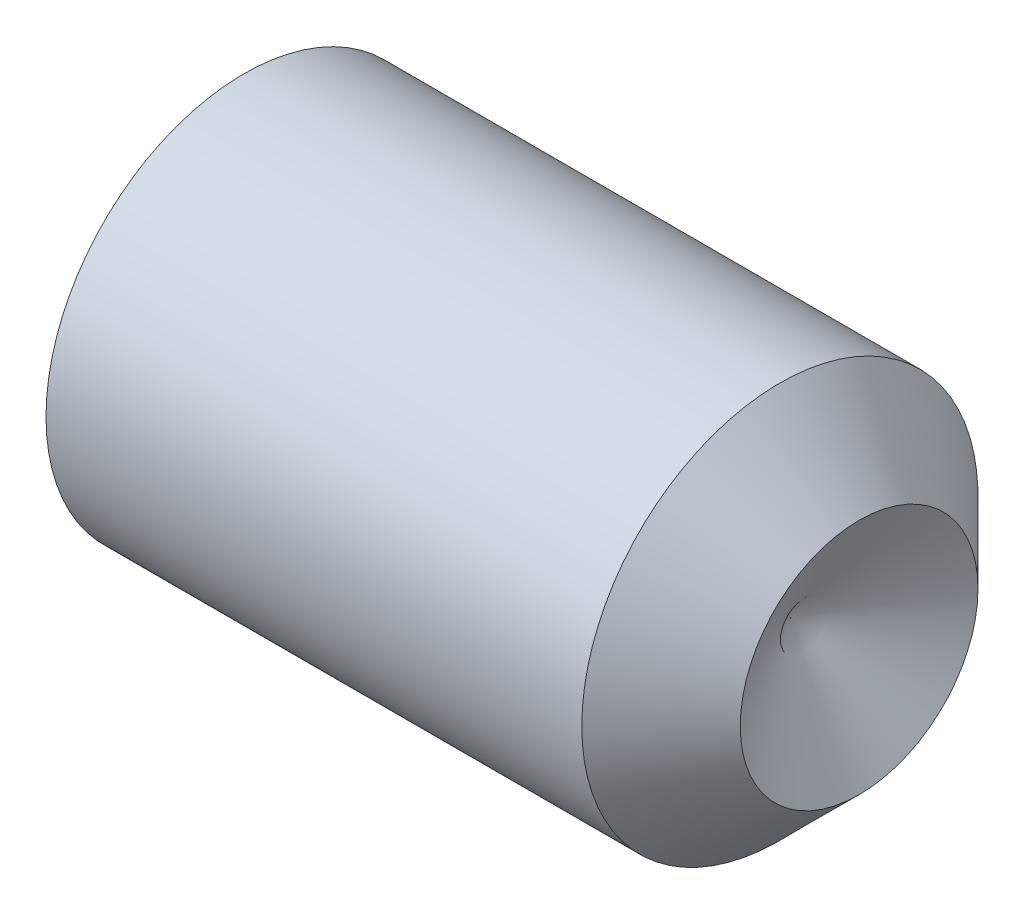
ISO-10303-21;
HEADER;
FILE_DESCRIPTION(('STEP AP214'),'2;1');
FILE_NAME('part.step','',(''),(''),'','','');
FILE_SCHEMA(('AUTOMOTIVE_DESIGN { 1 0 10303 214 1 1 1 1 }'));
ENDSEC;
DATA;
#1=APPLICATION_CONTEXT('core data for automotive mechanical design processes');
#2=APPLICATION_PROTOCOL_DEFINITION('international standard','automotive_design',2000,#1);
#3=PRODUCT_CONTEXT('',#1,'mechanical');
#4=PRODUCT('Part','Part','',(#3));
#5=PRODUCT_RELATED_PRODUCT_CATEGORY('part','',(#4));
#6=PRODUCT_DEFINITION_FORMATION('','',#4);
#7=PRODUCT_DEFINITION_CONTEXT('part definition',#1,'design');
#8=PRODUCT_DEFINITION('design','',#6,#7);
#9=PRODUCT_DEFINITION_SHAPE('','',#8);
#10=(LENGTH_UNIT() NAMED_UNIT(*) SI_UNIT(.MILLI.,.METRE.));
#11=(NAMED_UNIT(*) PLANE_ANGLE_UNIT() SI_UNIT($,.RADIAN.));
#12=(NAMED_UNIT(*) SI_UNIT($,.STERADIAN.) SOLID_ANGLE_UNIT());
#13=UNCERTAINTY_MEASURE_WITH_UNIT(LENGTH_MEASURE(1.E-05),#10,'distance_accuracy_value','');
#14=(GEOMETRIC_REPRESENTATION_CONTEXT(3) GLOBAL_UNCERTAINTY_ASSIGNED_CONTEXT((#13)) GLOBAL_UNIT_ASSIGNED_CONTEXT((#10,
#11,#12)) REPRESENTATION_CONTEXT('',''));
#15=CARTESIAN_POINT('',(0.,0.,0.));
#16=DIRECTION('',(0.,0.,1.));
#17=DIRECTION('',(1.,0.,0.));
#18=AXIS2_PLACEMENT_3D('',#15,#16,#17);
#19=CARTESIAN_POINT('',(0.,0.,0.));
#20=DIRECTION('',(-1.,0.,0.));
#21=DIRECTION('',(0.,0.,1.));
#22=AXIS2_PLACEMENT_3D('',#19,#20,#21);
#23=PLANE('',#22);
#24=CARTESIAN_POINT('',(0.,0.,0.));
#25=DIRECTION('',(-1.,0.,0.));
#26=DIRECTION('',(0.,0.,1.));
#27=AXIS2_PLACEMENT_3D('',#24,#25,#26);
#28=CIRCLE('',#27,4.172);
#29=CARTESIAN_POINT('',(0.,0.,4.172));
#30=VERTEX_POINT('',#29);
#31=EDGE_CURVE('E11',#30,#30,#28,.T.);
#32=ORIENTED_EDGE('',*,*,#31,.T.);
#33=EDGE_LOOP('',(#32));
#34=FACE_BOUND('',#33,.T.);
#35=DIRECTION('',(0.,0.,-1.));
#36=VECTOR('',#35,1.);
#37=CARTESIAN_POINT('',(0.,2.5,1.44337567297406));
#38=LINE('',#37,#36);
#39=CARTESIAN_POINT('',(0.,2.5,1.44337567297406));
#40=VERTEX_POINT('',#39);
#41=CARTESIAN_POINT('',(0.,2.5,-1.44337567297407));
#42=VERTEX_POINT('',#41);
#43=EDGE_CURVE('E111',#40,#42,#38,.T.);
#44=ORIENTED_EDGE('',*,*,#43,.F.);
#45=DIRECTION('',(0.,-0.866025403784439,0.5));
#46=VECTOR('',#45,1.);
#47=CARTESIAN_POINT('',(0.,2.5,1.44337567297406));
#48=LINE('',#47,#46);
#49=CARTESIAN_POINT('',(0.,0.,2.88675134594813));
#50=VERTEX_POINT('',#49);
#51=EDGE_CURVE('E51',#40,#50,#48,.T.);
#52=ORIENTED_EDGE('',*,*,#51,.T.);
#53=DIRECTION('',(0.,0.866025403784439,0.5));
#54=VECTOR('',#53,1.);
#55=CARTESIAN_POINT('',(0.,-2.5,1.44337567297406));
#56=LINE('',#55,#54);
#57=CARTESIAN_POINT('',(0.,-2.5,1.44337567297406));
#58=VERTEX_POINT('',#57);
#59=EDGE_CURVE('E100',#58,#50,#56,.T.);
#60=ORIENTED_EDGE('',*,*,#59,.F.);
#61=DIRECTION('',(0.,0.,-1.));
#62=VECTOR('',#61,1.);
#63=CARTESIAN_POINT('',(0.,-2.5,1.44337567297406));
#64=LINE('',#63,#62);
#65=CARTESIAN_POINT('',(0.,-2.5,-1.44337567297407));
#66=VERTEX_POINT('',#65);
#67=EDGE_CURVE('E106',#58,#66,#64,.T.);
#68=ORIENTED_EDGE('',*,*,#67,.T.);
#69=DIRECTION('',(0.,0.866025403784439,-0.5));
#70=VECTOR('',#69,1.);
#71=CARTESIAN_POINT('',(0.,-2.5,-1.44337567297407));
#72=LINE('',#71,#70);
#73=CARTESIAN_POINT('',(0.,0.,-2.88675134594813));
#74=VERTEX_POINT('',#73);
#75=EDGE_CURVE('E119',#66,#74,#72,.T.);
#76=ORIENTED_EDGE('',*,*,#75,.T.);
#77=DIRECTION('',(0.,-0.866025403784438,-0.5));
#78=VECTOR('',#77,1.);
#79=CARTESIAN_POINT('',(0.,2.5,-1.44337567297407));
#80=LINE('',#79,#78);
#81=EDGE_CURVE('E123',#42,#74,#80,.T.);
#82=ORIENTED_EDGE('',*,*,#81,.F.);
#83=EDGE_LOOP('',(#44,#52,#60,#68,#76,#82));
#84=FACE_BOUND('',#83,.T.);
#85=ADVANCED_FACE('F36',(#34,#84),#23,.T.);
#86=CARTESIAN_POINT('',(0.,0.,0.));
#87=DIRECTION('',(1.,0.,0.));
#88=DIRECTION('',(0.,0.,-1.));
#89=AXIS2_PLACEMENT_3D('',#86,#87,#88);
#90=CONICAL_SURFACE('',#89,4.172,1.0471975511966);
#91=CARTESIAN_POINT('',(0.478046022889008,0.,0.));
#92=DIRECTION('',(-1.,0.,0.));
#93=DIRECTION('',(0.,0.,1.));
#94=AXIS2_PLACEMENT_3D('',#91,#92,#93);
#95=CIRCLE('',#94,5.);
#96=CARTESIAN_POINT('',(0.478046022889008,0.,5.));
#97=VERTEX_POINT('',#96);
#98=EDGE_CURVE('E44',#97,#97,#95,.T.);
#99=ORIENTED_EDGE('',*,*,#98,.T.);
#100=EDGE_LOOP('',(#99));
#101=FACE_BOUND('',#100,.T.);
#102=ORIENTED_EDGE('',*,*,#31,.F.);
#103=EDGE_LOOP('',(#102));
#104=FACE_BOUND('',#103,.T.);
#105=ADVANCED_FACE('F170',(#101,#104),#90,.T.);
#106=CARTESIAN_POINT('',(-12.7,0.,0.));
#107=DIRECTION('',(-1.,0.,0.));
#108=DIRECTION('',(0.,0.,1.));
#109=AXIS2_PLACEMENT_3D('',#106,#107,#108);
#110=CYLINDRICAL_SURFACE('',#109,5.);
#111=CARTESIAN_POINT('',(14.,0.,0.));
#112=DIRECTION('',(-1.,0.,0.));
#113=DIRECTION('',(0.,0.,1.));
#114=AXIS2_PLACEMENT_3D('',#111,#112,#113);
#115=CIRCLE('',#114,5.);
#116=CARTESIAN_POINT('',(14.,0.,5.));
#117=VERTEX_POINT('',#116);
#118=EDGE_CURVE('E164',#117,#117,#115,.T.);
#119=ORIENTED_EDGE('',*,*,#118,.T.);
#120=EDGE_LOOP('',(#119));
#121=FACE_BOUND('',#120,.T.);
#122=ORIENTED_EDGE('',*,*,#98,.F.);
#123=EDGE_LOOP('',(#122));
#124=FACE_BOUND('',#123,.T.);
#125=ADVANCED_FACE('F173',(#121,#124),#110,.T.);
#126=CARTESIAN_POINT('',(14.,0.,0.));
#127=DIRECTION('',(-1.,0.,0.));
#128=DIRECTION('',(0.,0.,1.));
#129=AXIS2_PLACEMENT_3D('',#126,#127,#128);
#130=CONICAL_SURFACE('',#129,5.,0.785398163397446);
#131=CARTESIAN_POINT('',(16.,0.,0.));
#132=DIRECTION('',(-1.,0.,0.));
#133=DIRECTION('',(0.,0.,1.));
#134=AXIS2_PLACEMENT_3D('',#131,#132,#133);
#135=CIRCLE('',#134,3.);
#136=CARTESIAN_POINT('',(16.,0.,3.));
#137=VERTEX_POINT('',#136);
#138=EDGE_CURVE('E96',#137,#137,#135,.T.);
#139=ORIENTED_EDGE('',*,*,#138,.T.);
#140=EDGE_LOOP('',(#139));
#141=FACE_BOUND('',#140,.T.);
#142=ORIENTED_EDGE('',*,*,#118,.F.);
#143=EDGE_LOOP('',(#142));
#144=FACE_BOUND('',#143,.T.);
#145=ADVANCED_FACE('F175',(#141,#144),#130,.T.);
#146=CARTESIAN_POINT('',(14.2679491924311,0.,0.));
#147=DIRECTION('',(1.,0.,0.));
#148=DIRECTION('',(0.,0.,-1.));
#149=AXIS2_PLACEMENT_3D('',#146,#147,#148);
#150=CONICAL_SURFACE('',#149,0.,1.0471975511966);
#151=ORIENTED_EDGE('',*,*,#138,.F.);
#152=EDGE_LOOP('',(#151));
#153=FACE_BOUND('',#152,.T.);
#154=CARTESIAN_POINT('',(14.2679491924311,0.,0.));
#155=VERTEX_POINT('',#154);
#156=VERTEX_LOOP('',#155);
#157=FACE_BOUND('',#156,.T.);
#158=ADVANCED_FACE('F182',(#153,#157),#150,.F.);
#159=CARTESIAN_POINT('',(6.,2.5,1.44337567297406));
#160=DIRECTION('',(0.,-0.5,-0.866025403784439));
#161=DIRECTION('',(0.,0.866025403784439,-0.5));
#162=AXIS2_PLACEMENT_3D('',#159,#160,#161);
#163=PLANE('',#162);
#164=ORIENTED_EDGE('',*,*,#51,.F.);
#165=DIRECTION('',(-1.,0.,0.));
#166=VECTOR('',#165,1.);
#167=CARTESIAN_POINT('',(6.,2.5,1.44337567297406));
#168=LINE('',#167,#166);
#169=CARTESIAN_POINT('',(6.,2.5,1.44337567297406));
#170=VERTEX_POINT('',#169);
#171=EDGE_CURVE('E148',#170,#40,#168,.T.);
#172=ORIENTED_EDGE('',*,*,#171,.F.);
#173=DIRECTION('',(0.,-0.866025403784439,0.5));
#174=VECTOR('',#173,1.);
#175=CARTESIAN_POINT('',(6.,2.5,1.44337567297406));
#176=LINE('',#175,#174);
#177=CARTESIAN_POINT('',(6.,0.,2.88675134594813));
#178=VERTEX_POINT('',#177);
#179=EDGE_CURVE('E91',#170,#178,#176,.T.);
#180=ORIENTED_EDGE('',*,*,#179,.T.);
#181=DIRECTION('',(-1.,0.,0.));
#182=VECTOR('',#181,1.);
#183=CARTESIAN_POINT('',(6.,0.,2.88675134594813));
#184=LINE('',#183,#182);
#185=EDGE_CURVE('E87',#178,#50,#184,.T.);
#186=ORIENTED_EDGE('',*,*,#185,.T.);
#187=EDGE_LOOP('',(#164,#172,#180,#186));
#188=FACE_BOUND('',#187,.T.);
#189=ADVANCED_FACE('F89',(#188),#163,.T.);
#190=CARTESIAN_POINT('',(6.,-2.5,1.44337567297406));
#191=DIRECTION('',(0.,-0.5,0.866025403784439));
#192=DIRECTION('',(0.,-0.866025403784439,-0.5));
#193=AXIS2_PLACEMENT_3D('',#190,#191,#192);
#194=PLANE('',#193);
#195=ORIENTED_EDGE('',*,*,#59,.T.);
#196=ORIENTED_EDGE('',*,*,#185,.F.);
#197=DIRECTION('',(0.,0.866025403784439,0.5));
#198=VECTOR('',#197,1.);
#199=CARTESIAN_POINT('',(6.,-2.5,1.44337567297406));
#200=LINE('',#199,#198);
#201=CARTESIAN_POINT('',(6.,-2.5,1.44337567297406));
#202=VERTEX_POINT('',#201);
#203=EDGE_CURVE('E131',#202,#178,#200,.T.);
#204=ORIENTED_EDGE('',*,*,#203,.F.);
#205=DIRECTION('',(-1.,0.,0.));
#206=VECTOR('',#205,1.);
#207=CARTESIAN_POINT('',(6.,-2.5,1.44337567297406));
#208=LINE('',#207,#206);
#209=EDGE_CURVE('E97',#202,#58,#208,.T.);
#210=ORIENTED_EDGE('',*,*,#209,.T.);
#211=EDGE_LOOP('',(#195,#196,#204,#210));
#212=FACE_BOUND('',#211,.T.);
#213=ADVANCED_FACE('F101',(#212),#194,.F.);
#214=CARTESIAN_POINT('',(6.,-2.5,1.44337567297406));
#215=DIRECTION('',(0.,1.,0.));
#216=DIRECTION('',(0.,0.,1.));
#217=AXIS2_PLACEMENT_3D('',#214,#215,#216);
#218=PLANE('',#217);
#219=ORIENTED_EDGE('',*,*,#67,.F.);
#220=ORIENTED_EDGE('',*,*,#209,.F.);
#221=DIRECTION('',(0.,0.,-1.));
#222=VECTOR('',#221,1.);
#223=CARTESIAN_POINT('',(6.,-2.5,1.44337567297406));
#224=LINE('',#223,#222);
#225=CARTESIAN_POINT('',(6.,-2.5,-1.44337567297407));
#226=VERTEX_POINT('',#225);
#227=EDGE_CURVE('E134',#202,#226,#224,.T.);
#228=ORIENTED_EDGE('',*,*,#227,.T.);
#229=DIRECTION('',(-1.,0.,0.));
#230=VECTOR('',#229,1.);
#231=CARTESIAN_POINT('',(6.,-2.5,-1.44337567297407));
#232=LINE('',#231,#230);
#233=EDGE_CURVE('E156',#226,#66,#232,.T.);
#234=ORIENTED_EDGE('',*,*,#233,.T.);
#235=EDGE_LOOP('',(#219,#220,#228,#234));
#236=FACE_BOUND('',#235,.T.);
#237=ADVANCED_FACE('F223',(#236),#218,.T.);
#238=CARTESIAN_POINT('',(6.,-2.5,-1.44337567297407));
#239=DIRECTION('',(0.,0.5,0.866025403784438));
#240=DIRECTION('',(0.,-0.866025403784439,0.5));
#241=AXIS2_PLACEMENT_3D('',#238,#239,#240);
#242=PLANE('',#241);
#243=ORIENTED_EDGE('',*,*,#75,.F.);
#244=ORIENTED_EDGE('',*,*,#233,.F.);
#245=DIRECTION('',(0.,0.866025403784439,-0.5));
#246=VECTOR('',#245,1.);
#247=CARTESIAN_POINT('',(6.,-2.5,-1.44337567297407));
#248=LINE('',#247,#246);
#249=CARTESIAN_POINT('',(6.,0.,-2.88675134594813));
#250=VERTEX_POINT('',#249);
#251=EDGE_CURVE('E137',#226,#250,#248,.T.);
#252=ORIENTED_EDGE('',*,*,#251,.T.);
#253=DIRECTION('',(-1.,0.,0.));
#254=VECTOR('',#253,1.);
#255=CARTESIAN_POINT('',(6.,0.,-2.88675134594813));
#256=LINE('',#255,#254);
#257=EDGE_CURVE('E153',#250,#74,#256,.T.);
#258=ORIENTED_EDGE('',*,*,#257,.T.);
#259=EDGE_LOOP('',(#243,#244,#252,#258));
#260=FACE_BOUND('',#259,.T.);
#261=ADVANCED_FACE('F231',(#260),#242,.T.);
#262=CARTESIAN_POINT('',(6.,2.5,-1.44337567297407));
#263=DIRECTION('',(0.,0.5,-0.866025403784439));
#264=DIRECTION('',(0.,0.866025403784439,0.5));
#265=AXIS2_PLACEMENT_3D('',#262,#263,#264);
#266=PLANE('',#265);
#267=ORIENTED_EDGE('',*,*,#81,.T.);
#268=ORIENTED_EDGE('',*,*,#257,.F.);
#269=DIRECTION('',(0.,-0.866025403784438,-0.5));
#270=VECTOR('',#269,1.);
#271=CARTESIAN_POINT('',(6.,2.5,-1.44337567297407));
#272=LINE('',#271,#270);
#273=CARTESIAN_POINT('',(6.,2.5,-1.44337567297407));
#274=VERTEX_POINT('',#273);
#275=EDGE_CURVE('E140',#274,#250,#272,.T.);
#276=ORIENTED_EDGE('',*,*,#275,.F.);
#277=DIRECTION('',(-1.,0.,0.));
#278=VECTOR('',#277,1.);
#279=CARTESIAN_POINT('',(6.,2.5,-1.44337567297407));
#280=LINE('',#279,#278);
#281=EDGE_CURVE('E150',#274,#42,#280,.T.);
#282=ORIENTED_EDGE('',*,*,#281,.T.);
#283=EDGE_LOOP('',(#267,#268,#276,#282));
#284=FACE_BOUND('',#283,.T.);
#285=ADVANCED_FACE('F240',(#284),#266,.F.);
#286=CARTESIAN_POINT('',(6.,2.5,1.44337567297406));
#287=DIRECTION('',(0.,1.,0.));
#288=DIRECTION('',(0.,0.,1.));
#289=AXIS2_PLACEMENT_3D('',#286,#287,#288);
#290=PLANE('',#289);
#291=ORIENTED_EDGE('',*,*,#43,.T.);
#292=ORIENTED_EDGE('',*,*,#281,.F.);
#293=DIRECTION('',(0.,0.,-1.));
#294=VECTOR('',#293,1.);
#295=CARTESIAN_POINT('',(6.,2.5,1.44337567297406));
#296=LINE('',#295,#294);
#297=EDGE_CURVE('E144',#170,#274,#296,.T.);
#298=ORIENTED_EDGE('',*,*,#297,.F.);
#299=ORIENTED_EDGE('',*,*,#171,.T.);
#300=EDGE_LOOP('',(#291,#292,#298,#299));
#301=FACE_BOUND('',#300,.T.);
#302=ADVANCED_FACE('F249',(#301),#290,.F.);
#303=CARTESIAN_POINT('',(6.,2.5,1.44337567297406));
#304=DIRECTION('',(1.,0.,0.));
#305=DIRECTION('',(0.,0.,-1.));
#306=AXIS2_PLACEMENT_3D('',#303,#304,#305);
#307=PLANE('',#306);
#308=ORIENTED_EDGE('',*,*,#179,.F.);
#309=ORIENTED_EDGE('',*,*,#297,.T.);
#310=ORIENTED_EDGE('',*,*,#275,.T.);
#311=ORIENTED_EDGE('',*,*,#251,.F.);
#312=ORIENTED_EDGE('',*,*,#227,.F.);
#313=ORIENTED_EDGE('',*,*,#203,.T.);
#314=EDGE_LOOP('',(#308,#309,#310,#311,#312,#313));
#315=FACE_BOUND('',#314,.T.);
#316=ADVANCED_FACE('F258',(#315),#307,.F.);
#317=CLOSED_SHELL('',(#85,#105,#125,#145,#158,#189,#213,#237,#261,#285,#302,#316));
#318=MANIFOLD_SOLID_BREP('B2',#317);
#319=ADVANCED_BREP_SHAPE_REPRESENTATION('',(#18,#318),#14);
#320=SHAPE_DEFINITION_REPRESENTATION(#9,#319);
ENDSEC;
END-ISO-10303-21;
